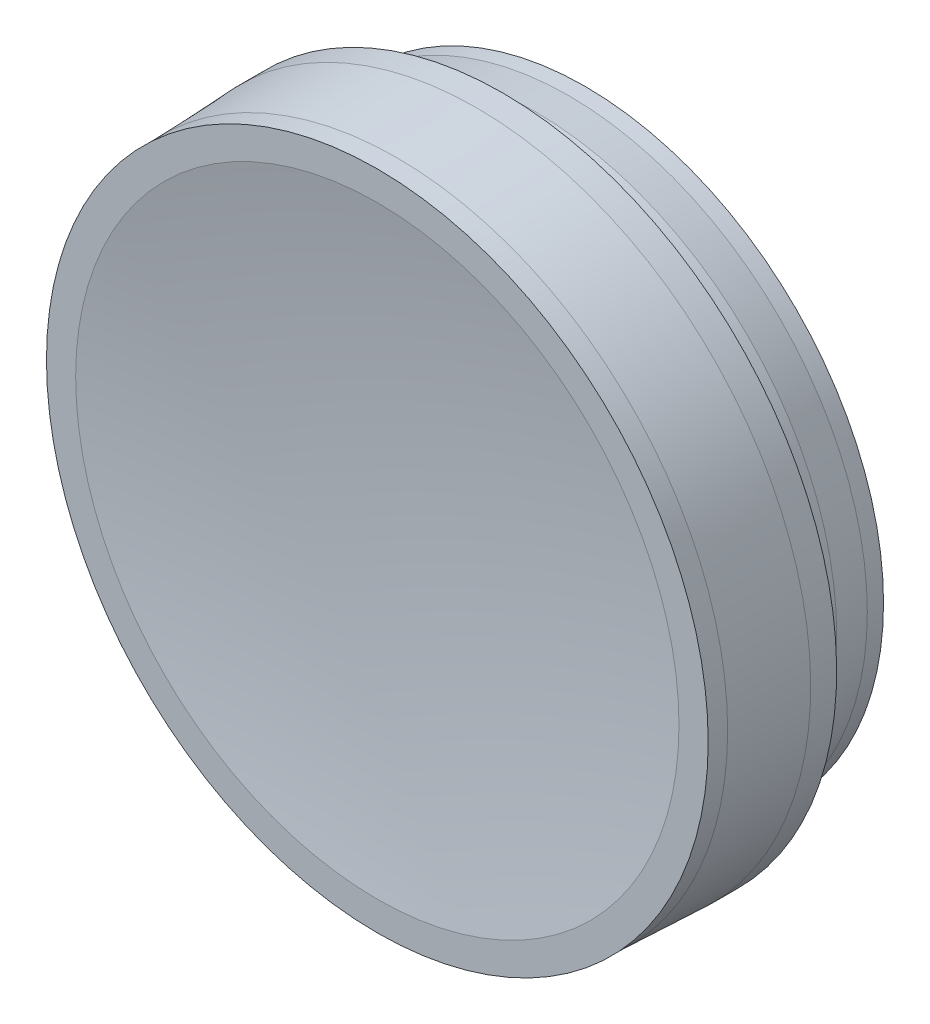
ISO-10303-21;
HEADER;
FILE_DESCRIPTION(('STEP AP214'),'2;1');
FILE_NAME('part.step','',(''),(''),'','','');
FILE_SCHEMA(('AUTOMOTIVE_DESIGN { 1 0 10303 214 1 1 1 1 }'));
ENDSEC;
DATA;
#1=APPLICATION_CONTEXT('core data for automotive mechanical design processes');
#2=APPLICATION_PROTOCOL_DEFINITION('international standard','automotive_design',2000,#1);
#3=PRODUCT_CONTEXT('',#1,'mechanical');
#4=PRODUCT('Part','Part','',(#3));
#5=PRODUCT_RELATED_PRODUCT_CATEGORY('part','',(#4));
#6=PRODUCT_DEFINITION_FORMATION('','',#4);
#7=PRODUCT_DEFINITION_CONTEXT('part definition',#1,'design');
#8=PRODUCT_DEFINITION('design','',#6,#7);
#9=PRODUCT_DEFINITION_SHAPE('','',#8);
#10=(LENGTH_UNIT() NAMED_UNIT(*) SI_UNIT(.MILLI.,.METRE.));
#11=(NAMED_UNIT(*) PLANE_ANGLE_UNIT() SI_UNIT($,.RADIAN.));
#12=(NAMED_UNIT(*) SI_UNIT($,.STERADIAN.) SOLID_ANGLE_UNIT());
#13=UNCERTAINTY_MEASURE_WITH_UNIT(LENGTH_MEASURE(1.E-05),#10,'distance_accuracy_value','');
#14=(GEOMETRIC_REPRESENTATION_CONTEXT(3) GLOBAL_UNCERTAINTY_ASSIGNED_CONTEXT((#13)) GLOBAL_UNIT_ASSIGNED_CONTEXT((#10,
#11,#12)) REPRESENTATION_CONTEXT('',''));
#15=CARTESIAN_POINT('',(0.,0.,0.));
#16=DIRECTION('',(0.,0.,1.));
#17=DIRECTION('',(1.,0.,0.));
#18=AXIS2_PLACEMENT_3D('',#15,#16,#17);
#19=CARTESIAN_POINT('',(0.,0.,31.9172829420325));
#20=DIRECTION('',(0.,0.,-1.));
#21=DIRECTION('',(0.,1.,0.));
#22=AXIS2_PLACEMENT_3D('',#19,#20,#21);
#23=SPHERICAL_SURFACE('',#22,28.9172829420324);
#24=CARTESIAN_POINT('',(0.,0.,3.37631672241126));
#25=DIRECTION('',(0.,0.,-1.));
#26=DIRECTION('',(0.,1.,0.));
#27=AXIS2_PLACEMENT_3D('',#24,#25,#26);
#28=CIRCLE('',#27,4.64999999999993);
#29=CARTESIAN_POINT('',(0.,4.64999999999993,3.37631672241126));
#30=VERTEX_POINT('',#29);
#31=EDGE_CURVE('E60',#30,#30,#28,.T.);
#32=ORIENTED_EDGE('',*,*,#31,.F.);
#33=EDGE_LOOP('',(#32));
#34=FACE_BOUND('',#33,.T.);
#35=ADVANCED_FACE('F33',(#34),#23,.F.);
#36=CARTESIAN_POINT('',(0.,0.,0.));
#37=CARTESIAN_POINT('',(0.,0.016666670000436,2.67539190952974E-06));
#38=CARTESIAN_POINT('',(0.,0.0500000250013018,8.02617813644048E-06));
#39=CARTESIAN_POINT('',(0.,0.100000021994643,8.78954068997327E-05));
#40=CARTESIAN_POINT('',(0.,0.150000062686221,0.000180392500421072));
#41=CARTESIAN_POINT('',(0.,0.200000094258004,0.000330535505724874));
#42=CARTESIAN_POINT('',(0.,0.25000005327554,0.000537467237792288));
#43=CARTESIAN_POINT('',(0.,0.300000136964818,0.000759597453587071));
#44=CARTESIAN_POINT('',(0.,0.350000116846177,0.00104414660881158));
#45=CARTESIAN_POINT('',(0.,0.400000131290399,0.00136382055806241));
#46=CARTESIAN_POINT('',(0.,0.450000200952865,0.00172057687889536));
#47=CARTESIAN_POINT('',(0.,0.500000168498902,0.00213388043830666));
#48=CARTESIAN_POINT('',(0.,0.550000181306437,0.00258391048577918));
#49=CARTESIAN_POINT('',(0.,0.600000269838638,0.00307048853742055));
#50=CARTESIAN_POINT('',(0.,0.650000215515057,0.00361415058638333));
#51=CARTESIAN_POINT('',(0.,0.700000244928236,0.00419292456695357));
#52=CARTESIAN_POINT('',(0.,0.750000244564134,0.00481416843261372));
#53=CARTESIAN_POINT('',(0.,0.800000359554946,0.00547042194593954));
#54=CARTESIAN_POINT('',(0.,0.850000280513386,0.00618417069462082));
#55=CARTESIAN_POINT('',(0.,0.900000314341884,0.00693292153330046));
#56=CARTESIAN_POINT('',(0.,0.950000309680226,0.00772417163368396));
#57=CARTESIAN_POINT('',(0.,1.00000044874383,0.0085504243390658));
#58=CARTESIAN_POINT('',(0.,1.05000034562686,0.00943417292367612));
#59=CARTESIAN_POINT('',(0.,1.10000038369772,0.0103529238786779));
#60=CARTESIAN_POINT('',(0.,1.15000037478436,0.0113141739684733));
#61=CARTESIAN_POINT('',(0.,1.20000053789975,0.0123104276651584));
#62=CARTESIAN_POINT('',(0.,1.25000041071435,0.0133641755951898));
#63=CARTESIAN_POINT('',(0.,1.30000045303682,0.0144529263671414));
#64=CARTESIAN_POINT('',(0.,1.35000043982509,0.0155841780569831));
#65=CARTESIAN_POINT('',(0.,1.40000062715842,0.0167504266780049));
#66=CARTESIAN_POINT('',(0.,1.45000047525071,0.0179741970720386));
#67=CARTESIAN_POINT('',(0.,1.50000052429512,0.0192328607892429));
#68=CARTESIAN_POINT('',(0.,1.55000049755553,0.0205344383791653));
#69=CARTESIAN_POINT('',(0.,1.60000074354339,0.0218694716342581));
#70=CARTESIAN_POINT('',(0.,1.65000034342695,0.0232677793202331));
#71=CARTESIAN_POINT('',(0.,1.70000078412361,0.0246794926175737));
#72=CARTESIAN_POINT('',(0.,1.750000566696,0.0261543670917589));
#73=CARTESIAN_POINT('',(0.,1.80000061683485,0.0276631484234063));
#74=CARTESIAN_POINT('',(0.,1.85000063452957,0.0292131514367841));
#75=CARTESIAN_POINT('',(0.,1.90000060933268,0.0308043640825496));
#76=CARTESIAN_POINT('',(0.,1.95000089968612,0.0324295200173006));
#77=CARTESIAN_POINT('',(0.,2.00000041685528,0.0341177090315388));
#78=CARTESIAN_POINT('',(0.,2.0500009318703,0.0358197624839991));
#79=CARTESIAN_POINT('',(0.,2.1000007118143,0.0375834094150246));
#80=CARTESIAN_POINT('',(0.,2.15000047947672,0.0393867516751291));
#81=CARTESIAN_POINT('',(0.,2.20000099949427,0.041209715518637));
#82=CARTESIAN_POINT('',(0.,2.25000071339518,0.0430945788063427));
#83=CARTESIAN_POINT('',(0.,2.30000082250874,0.0450121470091606));
#84=CARTESIAN_POINT('',(0.,2.35000051277305,0.0469770084429736));
#85=CARTESIAN_POINT('',(0.,2.40000107423454,0.0489599751001364));
#86=CARTESIAN_POINT('',(0.,2.4500008271305,0.0510033182054559));
#87=CARTESIAN_POINT('',(0.,2.50000054488128,0.053086955340056));
#88=CARTESIAN_POINT('',(0.,2.55000117999248,0.055189035704766));
#89=CARTESIAN_POINT('',(0.,2.60000056019204,0.0573571505920071));
#90=CARTESIAN_POINT('',(0.,2.65000091703197,0.0595425507530782));
#91=CARTESIAN_POINT('',(0.,2.70000092194972,0.0617728738904501));
#92=CARTESIAN_POINT('',(0.,2.7500006309003,0.0640461894273472));
#93=CARTESIAN_POINT('',(0.,2.80000096290819,0.0663425698575177));
#94=CARTESIAN_POINT('',(0.,2.85000092282271,0.0686837818972714));
#95=CARTESIAN_POINT('',(0.,2.90000099720879,0.0710625693076494));
#96=CARTESIAN_POINT('',(0.,2.95000067181472,0.0734862089512029));
#97=CARTESIAN_POINT('',(0.,3.00000101205851,0.0759328236245115));
#98=CARTESIAN_POINT('',(0.,3.05000103290761,0.0784227806273222));
#99=CARTESIAN_POINT('',(0.,3.10000069459908,0.0809563470896842));
#100=CARTESIAN_POINT('',(0.,3.15000109631521,0.0835120807813354));
#101=CARTESIAN_POINT('',(0.,3.20000075261136,0.0861156307051308));
#102=CARTESIAN_POINT('',(0.,3.2500007579343,0.0887456509542418));
#103=CARTESIAN_POINT('',(0.,3.30000114252732,0.091402025981312));
#104=CARTESIAN_POINT('',(0.,3.35000072921618,0.0941065698520226));
#105=CARTESIAN_POINT('',(0.,3.40000117417573,0.0968319787946047));
#106=CARTESIAN_POINT('',(0.,3.45000078861598,0.0996058567311405));
#107=CARTESIAN_POINT('',(0.,3.50000085062844,0.102404882874706));
#108=CARTESIAN_POINT('',(0.,3.55000085986194,0.105234896095803));
#109=CARTESIAN_POINT('',(0.,3.60000081439377,0.108095823238179));
#110=CARTESIAN_POINT('',(0.,3.65000123486066,0.11098211861102));
#111=CARTESIAN_POINT('',(0.,3.700000819894,0.113916084932581));
#112=CARTESIAN_POINT('',(0.,3.75000096057686,0.116873864190467));
#113=CARTESIAN_POINT('',(0.,3.80000047362098,0.119868763955597));
#114=CARTESIAN_POINT('',(0.,3.85000133285685,0.122871331171278));
#115=CARTESIAN_POINT('',(0.,3.90000083954116,0.125926313968447));
#116=CARTESIAN_POINT('',(0.,3.95000100557813,0.129003762253852));
#117=CARTESIAN_POINT('',(0.,4.00000047968467,0.13211896772607));
#118=CARTESIAN_POINT('',(0.,4.05000142972508,0.13524063841094));
#119=CARTESIAN_POINT('',(0.,4.1000004948475,0.138418900316245));
#120=CARTESIAN_POINT('',(0.,4.15000102196409,0.141604042279231));
#121=CARTESIAN_POINT('',(0.,4.2000009525489,0.144825285255006));
#122=CARTESIAN_POINT('',(0.,4.250000966561,0.148075191948215));
#123=CARTESIAN_POINT('',(0.,4.30000103325602,0.151354329038096));
#124=CARTESIAN_POINT('',(0.,4.35000058440251,0.154667866555467));
#125=CARTESIAN_POINT('',(0.,4.40000103636818,0.157994497389081));
#126=CARTESIAN_POINT('',(0.,4.45000104494082,0.161354530106216));
#127=CARTESIAN_POINT('',(0.,4.50000060468397,0.164747775212159));
#128=CARTESIAN_POINT('',(0.,4.55000104878991,0.168154675900779));
#129=CARTESIAN_POINT('',(0.,4.6000011117484,0.171593925975698));
#130=CARTESIAN_POINT('',(0.,4.63333347468406,0.173911292721659));
#131=CARTESIAN_POINT('',(0.,4.65,0.17507));
#132=B_SPLINE_CURVE_WITH_KNOTS('',3,(#36,#37,#38,#39,#40,#41,#42,#43,#44,#45,#46,#47,#48,#49,
#50,#51,#52,#53,#54,#55,#56,#57,#58,#59,#60,#61,#62,#63,#64,#65,#66,#67,#68,#69,#70,#71,#72,#73,
#74,#75,#76,#77,#78,#79,#80,#81,#82,#83,#84,#85,#86,#87,#88,#89,#90,#91,#92,#93,#94,#95,#96,#97,
#98,#99,#100,#101,#102,#103,#104,#105,#106,#107,#108,#109,#110,#111,#112,#113,#114,#115,#116,
#117,#118,#119,#120,#121,#122,#123,#124,#125,#126,#127,#128,#129,#130,#131),.UNSPECIFIED.,.F.,
.F.,(4,1,1,1,1,1,1,1,1,1,1,1,1,1,1,1,1,1,1,1,1,1,1,1,1,1,1,1,1,1,1,1,1,1,1,1,1,1,1,1,1,1,1,1,1,
1,1,1,1,1,1,1,1,1,1,1,1,1,1,1,1,1,1,1,1,1,1,1,1,1,1,1,1,1,1,1,1,1,1,1,1,1,1,1,1,1,1,1,1,1,1,1,1,
4),(0.,0.0107428151174582,0.021485639903444,0.0322284756470841,0.0429713382476726,
0.0537142384478759,0.0644571663642826,0.0752001490683226,0.0859431833369388,0.0966862760451088,
0.107429451470486,0.118172700803686,0.128916030919275,0.139659471679967,0.150403008690231,
0.161146648824079,0.171890398955325,0.182634296249298,0.193378319005961,0.204122474098394,
0.214866768399422,0.225611246375699,0.236355879023434,0.247100673214538,0.257845635820609,
0.268590818608084,0.279336185270426,0.290081742678137,0.300827497701351,0.311573509404495,
0.322319734179544,0.333066178895352,0.343812850420355,0.354559815114923,0.365306960861865,
0.376054416946528,0.386802129026221,0.397550103966949,0.408298348634212,0.419046869892995,
0.429795746544254,0.440544841578896,0.451294309164921,0.462044082512579,0.472794089684717,
0.483544495141207,0.494295226943688,0.50504629195238,0.515797611367367,0.52654936336658,
0.537301469148787,0.548053844768571,0.55880667868885,0.569559792731663,0.580313286269839,
0.591067166158317,0.601821340307628,0.612575912801593,0.623330890493086,0.634086280234205,
0.644841983508761,0.655598110822215,0.666354669024467,0.677111554888073,0.687868883625818,
0.698626549012958,0.709384554900909,0.720143020780404,0.730901836145923,0.741661123481915,
0.752420769287101,0.763180777410773,0.773941151701832,0.784701896008788,0.795463139656159,
0.806224762297732,0.816986767780679,0.827749030628323,0.838511813333883,0.849274990419849,
0.860038565731724,0.87080240866372,0.881566791962217,0.892331448006835,0.903096516373863,
0.913862000906778,0.924627905448611,0.935394233841944,0.946160846937489,0.956927890287827,
0.967695367734322,0.978463136712115,0.989231346187303,1.),.UNSPECIFIED.);
#133=CARTESIAN_POINT('',(0.,0.,-5.18912777449998));
#134=DIRECTION('',(0.,0.,-1.));
#135=AXIS1_PLACEMENT('',#133,#134);
#136=SURFACE_OF_REVOLUTION('',#132,#135);
#137=CARTESIAN_POINT('',(0.,0.,0.171468670176791));
#138=DIRECTION('',(0.,0.,-1.));
#139=DIRECTION('',(0.,1.,0.));
#140=AXIS2_PLACEMENT_3D('',#137,#138,#139);
#141=CIRCLE('',#140,4.59810052200582);
#142=CARTESIAN_POINT('',(0.,4.59810052200581,0.171468670176792));
#143=VERTEX_POINT('',#142);
#144=EDGE_CURVE('E11',#143,#143,#141,.T.);
#145=ORIENTED_EDGE('',*,*,#144,.T.);
#146=EDGE_LOOP('',(#145));
#147=FACE_BOUND('',#146,.T.);
#148=CARTESIAN_POINT('',(0.,0.,0.));
#149=VERTEX_POINT('',#148);
#150=VERTEX_LOOP('',#149);
#151=FACE_BOUND('',#150,.T.);
#152=ADVANCED_FACE('F42',(#147,#151),#136,.F.);
#153=CARTESIAN_POINT('',(0.,0.,-5.18912777449998));
#154=DIRECTION('',(0.,0.,-1.));
#155=DIRECTION('',(0.,1.,0.));
#156=AXIS2_PLACEMENT_3D('',#153,#154,#155);
#157=CYLINDRICAL_SURFACE('',#156,4.59810052200581);
#158=CARTESIAN_POINT('',(0.,0.,0.421468670176786));
#159=DIRECTION('',(0.,0.,-1.));
#160=DIRECTION('',(0.,1.,0.));
#161=AXIS2_PLACEMENT_3D('',#158,#159,#160);
#162=CIRCLE('',#161,4.59810052200581);
#163=CARTESIAN_POINT('',(0.,4.59810052200581,0.421468670176787));
#164=VERTEX_POINT('',#163);
#165=EDGE_CURVE('E39',#164,#164,#162,.T.);
#166=ORIENTED_EDGE('',*,*,#165,.T.);
#167=EDGE_LOOP('',(#166));
#168=FACE_BOUND('',#167,.T.);
#169=ORIENTED_EDGE('',*,*,#144,.F.);
#170=EDGE_LOOP('',(#169));
#171=FACE_BOUND('',#170,.T.);
#172=ADVANCED_FACE('F44',(#168,#171),#157,.T.);
#173=CARTESIAN_POINT('',(0.,0.,0.421468670176786));
#174=DIRECTION('',(0.,0.,1.));
#175=DIRECTION('',(0.,-1.,0.));
#176=AXIS2_PLACEMENT_3D('',#173,#174,#175);
#177=CONICAL_SURFACE('',#176,4.59810052200581,0.0986288306800835);
#178=CARTESIAN_POINT('',(0.,0.,0.945971311173714));
#179=DIRECTION('',(0.,0.,-1.));
#180=DIRECTION('',(0.,1.,0.));
#181=AXIS2_PLACEMENT_3D('',#178,#179,#180);
#182=CIRCLE('',#181,4.65);
#183=CARTESIAN_POINT('',(0.,4.65,0.945971311173714));
#184=VERTEX_POINT('',#183);
#185=EDGE_CURVE('E81',#184,#184,#182,.T.);
#186=ORIENTED_EDGE('',*,*,#185,.T.);
#187=EDGE_LOOP('',(#186));
#188=FACE_BOUND('',#187,.T.);
#189=ORIENTED_EDGE('',*,*,#165,.F.);
#190=EDGE_LOOP('',(#189));
#191=FACE_BOUND('',#190,.T.);
#192=ADVANCED_FACE('F50',(#188,#191),#177,.T.);
#193=CARTESIAN_POINT('',(0.,0.,-5.18912777449998));
#194=DIRECTION('',(0.,0.,-1.));
#195=DIRECTION('',(0.,1.,0.));
#196=AXIS2_PLACEMENT_3D('',#193,#194,#195);
#197=CYLINDRICAL_SURFACE('',#196,4.65);
#198=CARTESIAN_POINT('',(0.,0.,1.44597131117371));
#199=DIRECTION('',(0.,0.,-1.));
#200=DIRECTION('',(0.,1.,0.));
#201=AXIS2_PLACEMENT_3D('',#198,#199,#200);
#202=CIRCLE('',#201,4.65);
#203=CARTESIAN_POINT('',(0.,4.65,1.44597131117371));
#204=VERTEX_POINT('',#203);
#205=EDGE_CURVE('E78',#204,#204,#202,.T.);
#206=ORIENTED_EDGE('',*,*,#205,.T.);
#207=EDGE_LOOP('',(#206));
#208=FACE_BOUND('',#207,.T.);
#209=ORIENTED_EDGE('',*,*,#185,.F.);
#210=EDGE_LOOP('',(#209));
#211=FACE_BOUND('',#210,.T.);
#212=ADVANCED_FACE('F88',(#208,#211),#197,.T.);
#213=CARTESIAN_POINT('',(0.,4.65,1.44597131117371));
#214=DIRECTION('',(0.,0.,-1.));
#215=DIRECTION('',(0.,1.,0.));
#216=AXIS2_PLACEMENT_3D('',#213,#214,#215);
#217=PLANE('',#216);
#218=CARTESIAN_POINT('',(0.,0.,1.44597131117371));
#219=DIRECTION('',(0.,0.,-1.));
#220=DIRECTION('',(0.,1.,0.));
#221=AXIS2_PLACEMENT_3D('',#218,#219,#220);
#222=CIRCLE('',#221,5.15);
#223=CARTESIAN_POINT('',(0.,5.15,1.44597131117371));
#224=VERTEX_POINT('',#223);
#225=EDGE_CURVE('E75',#224,#224,#222,.T.);
#226=ORIENTED_EDGE('',*,*,#225,.T.);
#227=EDGE_LOOP('',(#226));
#228=FACE_BOUND('',#227,.T.);
#229=ORIENTED_EDGE('',*,*,#205,.F.);
#230=EDGE_LOOP('',(#229));
#231=FACE_BOUND('',#230,.T.);
#232=ADVANCED_FACE('F93',(#228,#231),#217,.T.);
#233=CARTESIAN_POINT('',(0.,0.,-5.18912777449998));
#234=DIRECTION('',(0.,0.,-1.));
#235=DIRECTION('',(0.,1.,0.));
#236=AXIS2_PLACEMENT_3D('',#233,#234,#235);
#237=CYLINDRICAL_SURFACE('',#236,5.15);
#238=CARTESIAN_POINT('',(0.,0.,1.84597131117371));
#239=DIRECTION('',(0.,0.,-1.));
#240=DIRECTION('',(0.,1.,0.));
#241=AXIS2_PLACEMENT_3D('',#238,#239,#240);
#242=CIRCLE('',#241,5.15);
#243=CARTESIAN_POINT('',(0.,5.15,1.84597131117372));
#244=VERTEX_POINT('',#243);
#245=EDGE_CURVE('E72',#244,#244,#242,.T.);
#246=ORIENTED_EDGE('',*,*,#245,.T.);
#247=EDGE_LOOP('',(#246));
#248=FACE_BOUND('',#247,.T.);
#249=ORIENTED_EDGE('',*,*,#225,.F.);
#250=EDGE_LOOP('',(#249));
#251=FACE_BOUND('',#250,.T.);
#252=ADVANCED_FACE('F99',(#248,#251),#237,.T.);
#253=CARTESIAN_POINT('',(0.,0.,1.84597131117371));
#254=DIRECTION('',(0.,0.,-1.));
#255=DIRECTION('',(0.,1.,0.));
#256=AXIS2_PLACEMENT_3D('',#253,#254,#255);
#257=CONICAL_SURFACE('',#256,5.15,0.0406166441738654);
#258=CARTESIAN_POINT('',(0.,0.,3.07631672241125));
#259=DIRECTION('',(0.,0.,-1.));
#260=DIRECTION('',(0.,1.,0.));
#261=AXIS2_PLACEMENT_3D('',#258,#259,#260);
#262=CIRCLE('',#261,5.1);
#263=CARTESIAN_POINT('',(0.,5.1,3.07631672241125));
#264=VERTEX_POINT('',#263);
#265=EDGE_CURVE('E69',#264,#264,#262,.T.);
#266=ORIENTED_EDGE('',*,*,#265,.T.);
#267=EDGE_LOOP('',(#266));
#268=FACE_BOUND('',#267,.T.);
#269=ORIENTED_EDGE('',*,*,#245,.F.);
#270=EDGE_LOOP('',(#269));
#271=FACE_BOUND('',#270,.T.);
#272=ADVANCED_FACE('F103',(#268,#271),#257,.T.);
#273=CARTESIAN_POINT('',(0.,0.,-5.18912777449998));
#274=DIRECTION('',(0.,0.,-1.));
#275=DIRECTION('',(0.,1.,0.));
#276=AXIS2_PLACEMENT_3D('',#273,#274,#275);
#277=CYLINDRICAL_SURFACE('',#276,5.1);
#278=CARTESIAN_POINT('',(0.,0.,3.37631672241125));
#279=DIRECTION('',(0.,0.,-1.));
#280=DIRECTION('',(0.,1.,0.));
#281=AXIS2_PLACEMENT_3D('',#278,#279,#280);
#282=CIRCLE('',#281,5.1);
#283=CARTESIAN_POINT('',(0.,5.1,3.37631672241125));
#284=VERTEX_POINT('',#283);
#285=EDGE_CURVE('E66',#284,#284,#282,.T.);
#286=ORIENTED_EDGE('',*,*,#285,.T.);
#287=EDGE_LOOP('',(#286));
#288=FACE_BOUND('',#287,.T.);
#289=ORIENTED_EDGE('',*,*,#265,.F.);
#290=EDGE_LOOP('',(#289));
#291=FACE_BOUND('',#290,.T.);
#292=ADVANCED_FACE('F107',(#288,#291),#277,.T.);
#293=CARTESIAN_POINT('',(0.,4.64999999999993,3.37631672241125));
#294=DIRECTION('',(0.,0.,1.));
#295=DIRECTION('',(0.,-1.,0.));
#296=AXIS2_PLACEMENT_3D('',#293,#294,#295);
#297=PLANE('',#296);
#298=ORIENTED_EDGE('',*,*,#31,.T.);
#299=EDGE_LOOP('',(#298));
#300=FACE_BOUND('',#299,.T.);
#301=ORIENTED_EDGE('',*,*,#285,.F.);
#302=EDGE_LOOP('',(#301));
#303=FACE_BOUND('',#302,.T.);
#304=ADVANCED_FACE('F111',(#300,#303),#297,.T.);
#305=CLOSED_SHELL('',(#35,#152,#172,#192,#212,#232,#252,#272,#292,#304));
#306=MANIFOLD_SOLID_BREP('B2',#305);
#307=ADVANCED_BREP_SHAPE_REPRESENTATION('',(#18,#306),#14);
#308=SHAPE_DEFINITION_REPRESENTATION(#9,#307);
ENDSEC;
END-ISO-10303-21;
